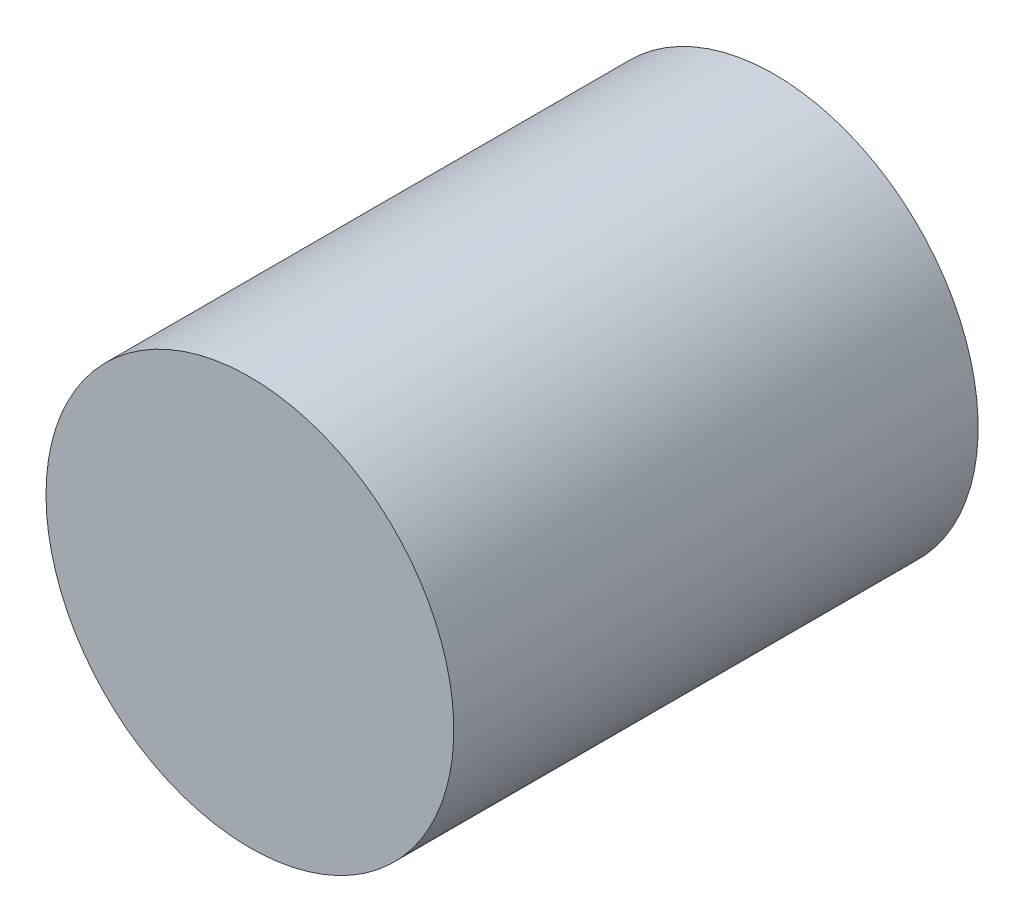
ISO-10303-21;
HEADER;
FILE_DESCRIPTION(('STEP AP214'),'2;1');
FILE_NAME('part.step','',(''),(''),'','','');
FILE_SCHEMA(('AUTOMOTIVE_DESIGN { 1 0 10303 214 1 1 1 1 }'));
ENDSEC;
DATA;
#1=APPLICATION_CONTEXT('core data for automotive mechanical design processes');
#2=APPLICATION_PROTOCOL_DEFINITION('international standard','automotive_design',2000,#1);
#3=PRODUCT_CONTEXT('',#1,'mechanical');
#4=PRODUCT('Part','Part','',(#3));
#5=PRODUCT_RELATED_PRODUCT_CATEGORY('part','',(#4));
#6=PRODUCT_DEFINITION_FORMATION('','',#4);
#7=PRODUCT_DEFINITION_CONTEXT('part definition',#1,'design');
#8=PRODUCT_DEFINITION('design','',#6,#7);
#9=PRODUCT_DEFINITION_SHAPE('','',#8);
#10=(LENGTH_UNIT() NAMED_UNIT(*) SI_UNIT(.MILLI.,.METRE.));
#11=(NAMED_UNIT(*) PLANE_ANGLE_UNIT() SI_UNIT($,.RADIAN.));
#12=(NAMED_UNIT(*) SI_UNIT($,.STERADIAN.) SOLID_ANGLE_UNIT());
#13=UNCERTAINTY_MEASURE_WITH_UNIT(LENGTH_MEASURE(1.E-05),#10,'distance_accuracy_value','');
#14=(GEOMETRIC_REPRESENTATION_CONTEXT(3) GLOBAL_UNCERTAINTY_ASSIGNED_CONTEXT((#13)) GLOBAL_UNIT_ASSIGNED_CONTEXT((#10,
#11,#12)) REPRESENTATION_CONTEXT('',''));
#15=CARTESIAN_POINT('',(0.,0.,0.));
#16=DIRECTION('',(0.,0.,1.));
#17=DIRECTION('',(1.,0.,0.));
#18=AXIS2_PLACEMENT_3D('',#15,#16,#17);
#19=CARTESIAN_POINT('',(0.,0.,90.));
#20=DIRECTION('',(0.,0.,-1.));
#21=DIRECTION('',(-1.,0.,0.));
#22=AXIS2_PLACEMENT_3D('',#19,#20,#21);
#23=CYLINDRICAL_SURFACE('',#22,35.);
#24=CARTESIAN_POINT('',(0.,0.,90.));
#25=DIRECTION('',(0.,0.,1.));
#26=DIRECTION('',(1.,0.,0.));
#27=AXIS2_PLACEMENT_3D('',#24,#25,#26);
#28=CIRCLE('',#27,35.);
#29=CARTESIAN_POINT('',(-35.,0.,90.));
#30=VERTEX_POINT('',#29);
#31=EDGE_CURVE('E10',#30,#30,#28,.T.);
#32=CARTESIAN_POINT('',(0.,0.,0.));
#33=DIRECTION('',(0.,0.,1.));
#34=DIRECTION('',(1.,0.,0.));
#35=AXIS2_PLACEMENT_3D('',#32,#33,#34);
#36=CIRCLE('',#35,35.);
#37=CARTESIAN_POINT('',(-35.,0.,0.));
#38=VERTEX_POINT('',#37);
#39=EDGE_CURVE('E42',#38,#38,#36,.T.);
#40=CARTESIAN_POINT('',(-35.,0.,90.));
#41=CARTESIAN_POINT('',(-35.,0.,89.0625));
#42=CARTESIAN_POINT('',(-35.,0.,88.125));
#43=CARTESIAN_POINT('',(-35.,0.,86.25));
#44=CARTESIAN_POINT('',(-35.,0.,85.3125));
#45=CARTESIAN_POINT('',(-35.,0.,83.4375));
#46=CARTESIAN_POINT('',(-35.,0.,82.5));
#47=CARTESIAN_POINT('',(-35.,0.,80.625));
#48=CARTESIAN_POINT('',(-35.,0.,79.6875));
#49=CARTESIAN_POINT('',(-35.,0.,77.8125));
#50=CARTESIAN_POINT('',(-35.,0.,76.875));
#51=CARTESIAN_POINT('',(-35.,0.,75.));
#52=CARTESIAN_POINT('',(-35.,0.,74.0625));
#53=CARTESIAN_POINT('',(-35.,0.,72.1875));
#54=CARTESIAN_POINT('',(-35.,0.,71.25));
#55=CARTESIAN_POINT('',(-35.,0.,69.375));
#56=CARTESIAN_POINT('',(-35.,0.,68.4375));
#57=CARTESIAN_POINT('',(-35.,0.,66.5625));
#58=CARTESIAN_POINT('',(-35.,0.,65.625));
#59=CARTESIAN_POINT('',(-35.,0.,63.75));
#60=CARTESIAN_POINT('',(-35.,0.,62.8125));
#61=CARTESIAN_POINT('',(-35.,0.,60.9375));
#62=CARTESIAN_POINT('',(-35.,0.,60.));
#63=CARTESIAN_POINT('',(-35.,0.,58.125));
#64=CARTESIAN_POINT('',(-35.,0.,57.1875));
#65=CARTESIAN_POINT('',(-35.,0.,55.3125));
#66=CARTESIAN_POINT('',(-35.,0.,54.375));
#67=CARTESIAN_POINT('',(-35.,0.,52.5));
#68=CARTESIAN_POINT('',(-35.,0.,51.5625));
#69=CARTESIAN_POINT('',(-35.,0.,49.6875));
#70=CARTESIAN_POINT('',(-35.,0.,48.75));
#71=CARTESIAN_POINT('',(-35.,0.,46.875));
#72=CARTESIAN_POINT('',(-35.,0.,45.9375));
#73=CARTESIAN_POINT('',(-35.,0.,44.0625));
#74=CARTESIAN_POINT('',(-35.,0.,43.125));
#75=CARTESIAN_POINT('',(-35.,0.,41.25));
#76=CARTESIAN_POINT('',(-35.,0.,40.3125));
#77=CARTESIAN_POINT('',(-35.,0.,38.4375));
#78=CARTESIAN_POINT('',(-35.,0.,37.5));
#79=CARTESIAN_POINT('',(-35.,0.,35.625));
#80=CARTESIAN_POINT('',(-35.,0.,34.6875));
#81=CARTESIAN_POINT('',(-35.,0.,32.8125));
#82=CARTESIAN_POINT('',(-35.,0.,31.875));
#83=CARTESIAN_POINT('',(-35.,0.,30.));
#84=CARTESIAN_POINT('',(-35.,0.,29.0625));
#85=CARTESIAN_POINT('',(-35.,0.,27.1875));
#86=CARTESIAN_POINT('',(-35.,0.,26.25));
#87=CARTESIAN_POINT('',(-35.,0.,24.375));
#88=CARTESIAN_POINT('',(-35.,0.,23.4375));
#89=CARTESIAN_POINT('',(-35.,0.,21.5625));
#90=CARTESIAN_POINT('',(-35.,0.,20.625));
#91=CARTESIAN_POINT('',(-35.,0.,18.75));
#92=CARTESIAN_POINT('',(-35.,0.,17.8125));
#93=CARTESIAN_POINT('',(-35.,0.,15.9375));
#94=CARTESIAN_POINT('',(-35.,0.,15.));
#95=CARTESIAN_POINT('',(-35.,0.,13.125));
#96=CARTESIAN_POINT('',(-35.,0.,12.1875));
#97=CARTESIAN_POINT('',(-35.,0.,10.3125));
#98=CARTESIAN_POINT('',(-35.,0.,9.37499999999999));
#99=CARTESIAN_POINT('',(-35.,0.,7.49999999999999));
#100=CARTESIAN_POINT('',(-35.,0.,6.56249999999999));
#101=CARTESIAN_POINT('',(-35.,0.,4.68749999999999));
#102=CARTESIAN_POINT('',(-35.,0.,3.74999999999998));
#103=CARTESIAN_POINT('',(-35.,0.,1.87499999999998));
#104=CARTESIAN_POINT('',(-35.,0.,0.937499999999986));
#105=CARTESIAN_POINT('',(-35.,0.,0.));
#106=B_SPLINE_CURVE_WITH_KNOTS('',3,(#40,#41,#42,#43,#44,#45,#46,#47,#48,#49,#50,#51,#52,#53,
#54,#55,#56,#57,#58,#59,#60,#61,#62,#63,#64,#65,#66,#67,#68,#69,#70,#71,#72,#73,#74,#75,#76,#77,
#78,#79,#80,#81,#82,#83,#84,#85,#86,#87,#88,#89,#90,#91,#92,#93,#94,#95,#96,#97,#98,#99,#100,
#101,#102,#103,#104,#105),.UNSPECIFIED.,.F.,.F.,(4,2,2,2,2,2,2,2,2,2,2,2,2,2,2,2,2,2,2,2,2,2,2,
2,2,2,2,2,2,2,2,2,4),(0.,2.8125,5.62499999999999,8.43749999999999,11.25,14.0625,16.875,19.6875,
22.5,25.3125,28.125,30.9375,33.75,36.5625,39.375,42.1875,45.,47.8125,50.625,53.4375,56.25,
59.0625,61.875,64.6875,67.5,70.3125,73.125,75.9375,78.75,81.5625,84.375,87.1875,90.),.UNSPECIFIED.);
#107=EDGE_CURVE('BSEAM39',#30,#38,#106,.T.);
#108=ORIENTED_EDGE('',*,*,#31,.F.);
#109=ORIENTED_EDGE('',*,*,#39,.T.);
#110=ORIENTED_EDGE('',*,*,#107,.T.);
#111=ORIENTED_EDGE('',*,*,#107,.F.);
#112=EDGE_LOOP('',(#108,#110,#109,#111));
#113=FACE_BOUND('',#112,.T.);
#114=ADVANCED_FACE('F39',(#113),#23,.T.);
#115=CARTESIAN_POINT('',(0.,0.,90.));
#116=DIRECTION('',(0.,0.,1.));
#117=DIRECTION('',(1.,0.,0.));
#118=AXIS2_PLACEMENT_3D('',#115,#116,#117);
#119=PLANE('',#118);
#120=ORIENTED_EDGE('',*,*,#31,.T.);
#121=EDGE_LOOP('',(#120));
#122=FACE_BOUND('',#121,.T.);
#123=ADVANCED_FACE('F54',(#122),#119,.T.);
#124=CARTESIAN_POINT('',(0.,0.,0.));
#125=DIRECTION('',(0.,0.,1.));
#126=DIRECTION('',(1.,0.,0.));
#127=AXIS2_PLACEMENT_3D('',#124,#125,#126);
#128=PLANE('',#127);
#129=ORIENTED_EDGE('',*,*,#39,.F.);
#130=EDGE_LOOP('',(#129));
#131=FACE_BOUND('',#130,.T.);
#132=ADVANCED_FACE('F52',(#131),#128,.F.);
#133=CLOSED_SHELL('',(#114,#123,#132));
#134=MANIFOLD_SOLID_BREP('B2',#133);
#135=ADVANCED_BREP_SHAPE_REPRESENTATION('',(#18,#134),#14);
#136=SHAPE_DEFINITION_REPRESENTATION(#9,#135);
ENDSEC;
END-ISO-10303-21;
